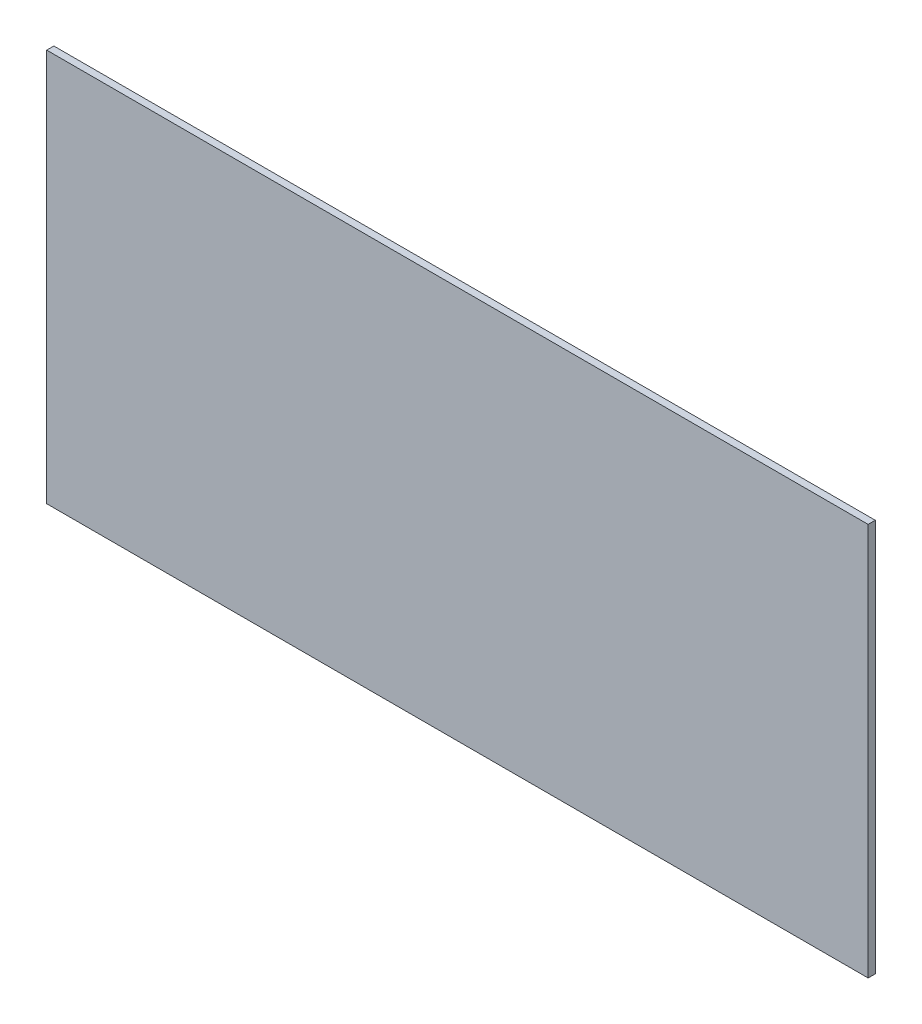
ISO-10303-21;
HEADER;
FILE_DESCRIPTION(('STEP AP214'),'2;1');
FILE_NAME('part.step','',(''),(''),'','','');
FILE_SCHEMA(('AUTOMOTIVE_DESIGN { 1 0 10303 214 1 1 1 1 }'));
ENDSEC;
DATA;
#1=APPLICATION_CONTEXT('core data for automotive mechanical design processes');
#2=APPLICATION_PROTOCOL_DEFINITION('international standard','automotive_design',2000,#1);
#3=PRODUCT_CONTEXT('',#1,'mechanical');
#4=PRODUCT('Part','Part','',(#3));
#5=PRODUCT_RELATED_PRODUCT_CATEGORY('part','',(#4));
#6=PRODUCT_DEFINITION_FORMATION('','',#4);
#7=PRODUCT_DEFINITION_CONTEXT('part definition',#1,'design');
#8=PRODUCT_DEFINITION('design','',#6,#7);
#9=PRODUCT_DEFINITION_SHAPE('','',#8);
#10=(LENGTH_UNIT() NAMED_UNIT(*) SI_UNIT(.MILLI.,.METRE.));
#11=(NAMED_UNIT(*) PLANE_ANGLE_UNIT() SI_UNIT($,.RADIAN.));
#12=(NAMED_UNIT(*) SI_UNIT($,.STERADIAN.) SOLID_ANGLE_UNIT());
#13=UNCERTAINTY_MEASURE_WITH_UNIT(LENGTH_MEASURE(1.E-05),#10,'distance_accuracy_value','');
#14=(GEOMETRIC_REPRESENTATION_CONTEXT(3) GLOBAL_UNCERTAINTY_ASSIGNED_CONTEXT((#13)) GLOBAL_UNIT_ASSIGNED_CONTEXT((#10,
#11,#12)) REPRESENTATION_CONTEXT('',''));
#15=CARTESIAN_POINT('',(0.,0.,0.));
#16=DIRECTION('',(0.,0.,1.));
#17=DIRECTION('',(1.,0.,0.));
#18=AXIS2_PLACEMENT_3D('',#15,#16,#17);
#19=CARTESIAN_POINT('',(-218.290155440414,94.8963730569948,2.));
#20=DIRECTION('',(1.,0.,0.));
#21=DIRECTION('',(0.,0.,-1.));
#22=AXIS2_PLACEMENT_3D('',#19,#20,#21);
#23=PLANE('',#22);
#24=DIRECTION('',(0.,-1.,0.));
#25=VECTOR('',#24,1.);
#26=CARTESIAN_POINT('',(-218.290155440414,94.8963730569948,0.));
#27=LINE('',#26,#25);
#28=CARTESIAN_POINT('',(-218.290155440414,94.8963730569948,0.));
#29=VERTEX_POINT('',#28);
#30=CARTESIAN_POINT('',(-218.290155440414,-15.1036269430052,0.));
#31=VERTEX_POINT('',#30);
#32=EDGE_CURVE('E106',#29,#31,#27,.T.);
#33=ORIENTED_EDGE('',*,*,#32,.T.);
#34=DIRECTION('',(0.,0.,-1.));
#35=VECTOR('',#34,1.);
#36=CARTESIAN_POINT('',(-218.290155440414,-15.1036269430052,2.));
#37=LINE('',#36,#35);
#38=CARTESIAN_POINT('',(-218.290155440414,-15.1036269430052,2.));
#39=VERTEX_POINT('',#38);
#40=EDGE_CURVE('E11',#39,#31,#37,.T.);
#41=ORIENTED_EDGE('',*,*,#40,.F.);
#42=DIRECTION('',(0.,-1.,0.));
#43=VECTOR('',#42,1.);
#44=CARTESIAN_POINT('',(-218.290155440414,94.8963730569948,2.));
#45=LINE('',#44,#43);
#46=CARTESIAN_POINT('',(-218.290155440414,94.8963730569948,2.));
#47=VERTEX_POINT('',#46);
#48=EDGE_CURVE('E94',#47,#39,#45,.T.);
#49=ORIENTED_EDGE('',*,*,#48,.F.);
#50=DIRECTION('',(0.,0.,-1.));
#51=VECTOR('',#50,1.);
#52=CARTESIAN_POINT('',(-218.290155440414,94.8963730569948,2.));
#53=LINE('',#52,#51);
#54=EDGE_CURVE('E102',#47,#29,#53,.T.);
#55=ORIENTED_EDGE('',*,*,#54,.T.);
#56=EDGE_LOOP('',(#33,#41,#49,#55));
#57=FACE_BOUND('',#56,.T.);
#58=ADVANCED_FACE('F43',(#57),#23,.F.);
#59=CARTESIAN_POINT('',(-218.290155440414,-15.1036269430052,2.));
#60=DIRECTION('',(0.,1.,0.));
#61=DIRECTION('',(-1.,0.,0.));
#62=AXIS2_PLACEMENT_3D('',#59,#60,#61);
#63=PLANE('',#62);
#64=DIRECTION('',(1.,0.,0.));
#65=VECTOR('',#64,1.);
#66=CARTESIAN_POINT('',(-218.290155440414,-15.1036269430052,0.));
#67=LINE('',#66,#65);
#68=CARTESIAN_POINT('',(11.7098445595855,-15.1036269430052,0.));
#69=VERTEX_POINT('',#68);
#70=EDGE_CURVE('E98',#31,#69,#67,.T.);
#71=ORIENTED_EDGE('',*,*,#70,.T.);
#72=DIRECTION('',(0.,0.,-1.));
#73=VECTOR('',#72,1.);
#74=CARTESIAN_POINT('',(11.7098445595855,-15.1036269430052,2.));
#75=LINE('',#74,#73);
#76=CARTESIAN_POINT('',(11.7098445595855,-15.1036269430052,2.));
#77=VERTEX_POINT('',#76);
#78=EDGE_CURVE('E51',#77,#69,#75,.T.);
#79=ORIENTED_EDGE('',*,*,#78,.F.);
#80=DIRECTION('',(1.,0.,0.));
#81=VECTOR('',#80,1.);
#82=CARTESIAN_POINT('',(-218.290155440414,-15.1036269430052,2.));
#83=LINE('',#82,#81);
#84=EDGE_CURVE('E89',#39,#77,#83,.T.);
#85=ORIENTED_EDGE('',*,*,#84,.F.);
#86=ORIENTED_EDGE('',*,*,#40,.T.);
#87=EDGE_LOOP('',(#71,#79,#85,#86));
#88=FACE_BOUND('',#87,.T.);
#89=ADVANCED_FACE('F97',(#88),#63,.F.);
#90=CARTESIAN_POINT('',(11.7098445595855,94.8963730569948,2.));
#91=DIRECTION('',(-1.,0.,0.));
#92=DIRECTION('',(0.,0.,1.));
#93=AXIS2_PLACEMENT_3D('',#90,#91,#92);
#94=PLANE('',#93);
#95=DIRECTION('',(0.,1.,0.));
#96=VECTOR('',#95,1.);
#97=CARTESIAN_POINT('',(11.7098445595855,94.8963730569948,0.));
#98=LINE('',#97,#96);
#99=CARTESIAN_POINT('',(11.7098445595855,94.8963730569948,0.));
#100=VERTEX_POINT('',#99);
#101=EDGE_CURVE('E76',#69,#100,#98,.T.);
#102=ORIENTED_EDGE('',*,*,#101,.T.);
#103=DIRECTION('',(0.,0.,-1.));
#104=VECTOR('',#103,1.);
#105=CARTESIAN_POINT('',(11.7098445595855,94.8963730569948,2.));
#106=LINE('',#105,#104);
#107=CARTESIAN_POINT('',(11.7098445595855,94.8963730569948,2.));
#108=VERTEX_POINT('',#107);
#109=EDGE_CURVE('E99',#108,#100,#106,.T.);
#110=ORIENTED_EDGE('',*,*,#109,.F.);
#111=DIRECTION('',(0.,1.,0.));
#112=VECTOR('',#111,1.);
#113=CARTESIAN_POINT('',(11.7098445595855,94.8963730569948,2.));
#114=LINE('',#113,#112);
#115=EDGE_CURVE('E92',#77,#108,#114,.T.);
#116=ORIENTED_EDGE('',*,*,#115,.F.);
#117=ORIENTED_EDGE('',*,*,#78,.T.);
#118=EDGE_LOOP('',(#102,#110,#116,#117));
#119=FACE_BOUND('',#118,.T.);
#120=ADVANCED_FACE('F100',(#119),#94,.F.);
#121=CARTESIAN_POINT('',(-218.290155440414,94.8963730569948,2.));
#122=DIRECTION('',(0.,-1.,0.));
#123=DIRECTION('',(0.,0.,-1.));
#124=AXIS2_PLACEMENT_3D('',#121,#122,#123);
#125=PLANE('',#124);
#126=DIRECTION('',(-1.,0.,0.));
#127=VECTOR('',#126,1.);
#128=CARTESIAN_POINT('',(-218.290155440414,94.8963730569948,0.));
#129=LINE('',#128,#127);
#130=EDGE_CURVE('E82',#100,#29,#129,.T.);
#131=ORIENTED_EDGE('',*,*,#130,.T.);
#132=ORIENTED_EDGE('',*,*,#54,.F.);
#133=DIRECTION('',(-1.,0.,0.));
#134=VECTOR('',#133,1.);
#135=CARTESIAN_POINT('',(-218.290155440414,94.8963730569948,2.));
#136=LINE('',#135,#134);
#137=EDGE_CURVE('E59',#108,#47,#136,.T.);
#138=ORIENTED_EDGE('',*,*,#137,.F.);
#139=ORIENTED_EDGE('',*,*,#109,.T.);
#140=EDGE_LOOP('',(#131,#132,#138,#139));
#141=FACE_BOUND('',#140,.T.);
#142=ADVANCED_FACE('F113',(#141),#125,.F.);
#143=CARTESIAN_POINT('',(0.,0.,2.));
#144=DIRECTION('',(0.,0.,1.));
#145=DIRECTION('',(1.,0.,0.));
#146=AXIS2_PLACEMENT_3D('',#143,#144,#145);
#147=PLANE('',#146);
#148=ORIENTED_EDGE('',*,*,#48,.T.);
#149=ORIENTED_EDGE('',*,*,#84,.T.);
#150=ORIENTED_EDGE('',*,*,#115,.T.);
#151=ORIENTED_EDGE('',*,*,#137,.T.);
#152=EDGE_LOOP('',(#148,#149,#150,#151));
#153=FACE_BOUND('',#152,.T.);
#154=ADVANCED_FACE('F90',(#153),#147,.T.);
#155=CARTESIAN_POINT('',(0.,0.,0.));
#156=DIRECTION('',(0.,0.,1.));
#157=DIRECTION('',(1.,0.,0.));
#158=AXIS2_PLACEMENT_3D('',#155,#156,#157);
#159=PLANE('',#158);
#160=ORIENTED_EDGE('',*,*,#32,.F.);
#161=ORIENTED_EDGE('',*,*,#130,.F.);
#162=ORIENTED_EDGE('',*,*,#101,.F.);
#163=ORIENTED_EDGE('',*,*,#70,.F.);
#164=EDGE_LOOP('',(#160,#161,#162,#163));
#165=FACE_BOUND('',#164,.T.);
#166=ADVANCED_FACE('F116',(#165),#159,.F.);
#167=CLOSED_SHELL('',(#58,#89,#120,#142,#154,#166));
#168=MANIFOLD_SOLID_BREP('B2',#167);
#169=ADVANCED_BREP_SHAPE_REPRESENTATION('',(#18,#168),#14);
#170=SHAPE_DEFINITION_REPRESENTATION(#9,#169);
ENDSEC;
END-ISO-10303-21;
